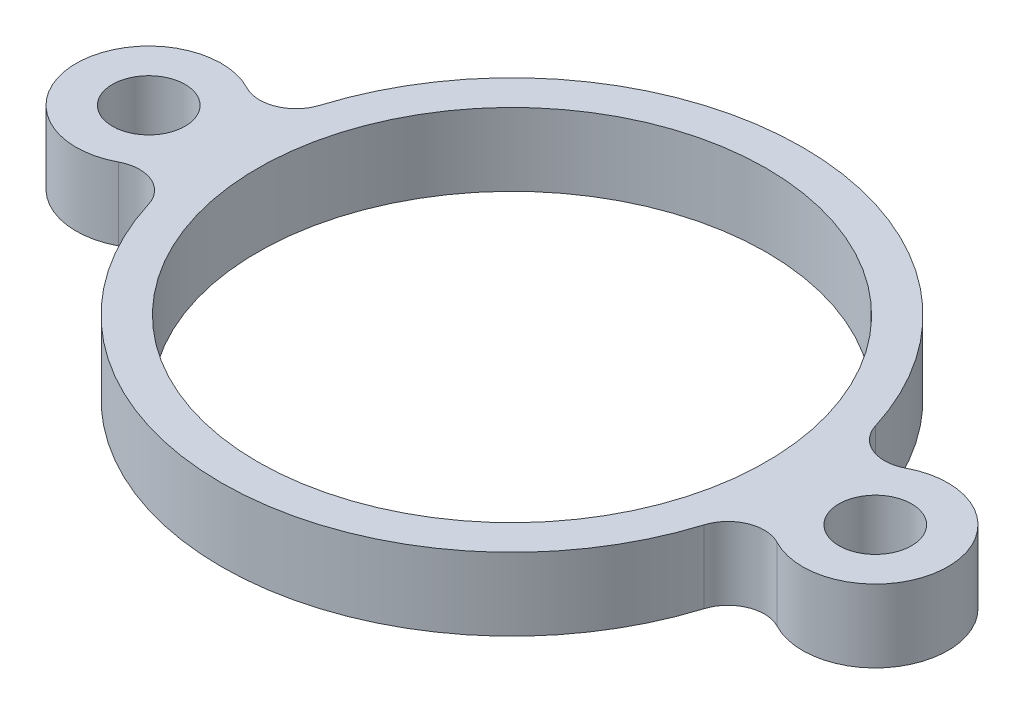
ISO-10303-21;
HEADER;
FILE_DESCRIPTION(('STEP AP214'),'2;1');
FILE_NAME('part.step','',(''),(''),'','','');
FILE_SCHEMA(('AUTOMOTIVE_DESIGN { 1 0 10303 214 1 1 1 1 }'));
ENDSEC;
DATA;
#1=APPLICATION_CONTEXT('core data for automotive mechanical design processes');
#2=APPLICATION_PROTOCOL_DEFINITION('international standard','automotive_design',2000,#1);
#3=PRODUCT_CONTEXT('',#1,'mechanical');
#4=PRODUCT('Part','Part','',(#3));
#5=PRODUCT_RELATED_PRODUCT_CATEGORY('part','',(#4));
#6=PRODUCT_DEFINITION_FORMATION('','',#4);
#7=PRODUCT_DEFINITION_CONTEXT('part definition',#1,'design');
#8=PRODUCT_DEFINITION('design','',#6,#7);
#9=PRODUCT_DEFINITION_SHAPE('','',#8);
#10=(LENGTH_UNIT() NAMED_UNIT(*) SI_UNIT(.MILLI.,.METRE.));
#11=(NAMED_UNIT(*) PLANE_ANGLE_UNIT() SI_UNIT($,.RADIAN.));
#12=(NAMED_UNIT(*) SI_UNIT($,.STERADIAN.) SOLID_ANGLE_UNIT());
#13=UNCERTAINTY_MEASURE_WITH_UNIT(LENGTH_MEASURE(1.E-05),#10,'distance_accuracy_value','');
#14=(GEOMETRIC_REPRESENTATION_CONTEXT(3) GLOBAL_UNCERTAINTY_ASSIGNED_CONTEXT((#13)) GLOBAL_UNIT_ASSIGNED_CONTEXT((#10,
#11,#12)) REPRESENTATION_CONTEXT('',''));
#15=CARTESIAN_POINT('',(0.,0.,0.));
#16=DIRECTION('',(0.,0.,1.));
#17=DIRECTION('',(1.,0.,0.));
#18=AXIS2_PLACEMENT_3D('',#15,#16,#17);
#19=CARTESIAN_POINT('',(21.5,10.,6.6332495807108));
#20=DIRECTION('',(0.,1.,0.));
#21=DIRECTION('',(0.,0.,1.));
#22=AXIS2_PLACEMENT_3D('',#19,#20,#21);
#23=PLANE('',#22);
#24=CARTESIAN_POINT('',(50.,10.,0.));
#25=DIRECTION('',(0.,1.,0.));
#26=DIRECTION('',(0.,0.,1.));
#27=AXIS2_PLACEMENT_3D('',#24,#25,#26);
#28=CIRCLE('',#27,5.);
#29=CARTESIAN_POINT('',(50.,10.,5.));
#30=VERTEX_POINT('',#29);
#31=EDGE_CURVE('E219',#30,#30,#28,.T.);
#32=ORIENTED_EDGE('',*,*,#31,.F.);
#33=EDGE_LOOP('',(#32));
#34=FACE_BOUND('',#33,.T.);
#35=CARTESIAN_POINT('',(43.,10.,13.2664991614216));
#36=DIRECTION('',(0.,-1.,0.));
#37=DIRECTION('',(0.,0.,1.));
#38=AXIS2_PLACEMENT_3D('',#35,#36,#37);
#39=CIRCLE('',#38,5.);
#40=CARTESIAN_POINT('',(38.2222222222222,10.,11.7924436990414));
#41=VERTEX_POINT('',#40);
#42=CARTESIAN_POINT('',(45.3333333333333,10.,8.84433277428107));
#43=VERTEX_POINT('',#42);
#44=EDGE_CURVE('E170',#41,#43,#39,.T.);
#45=ORIENTED_EDGE('',*,*,#44,.T.);
#46=CARTESIAN_POINT('',(50.,10.,0.));
#47=DIRECTION('',(0.,1.,0.));
#48=DIRECTION('',(0.,0.,1.));
#49=AXIS2_PLACEMENT_3D('',#46,#47,#48);
#50=CIRCLE('',#49,10.);
#51=CARTESIAN_POINT('',(45.3333333333333,10.,-8.84433277428107));
#52=VERTEX_POINT('',#51);
#53=EDGE_CURVE('E106',#43,#52,#50,.T.);
#54=ORIENTED_EDGE('',*,*,#53,.T.);
#55=CARTESIAN_POINT('',(43.,10.,-13.2664991614216));
#56=DIRECTION('',(0.,-1.,0.));
#57=DIRECTION('',(0.,0.,-1.));
#58=AXIS2_PLACEMENT_3D('',#55,#56,#57);
#59=CIRCLE('',#58,5.);
#60=CARTESIAN_POINT('',(38.2222222222222,10.,-11.7924436990414));
#61=VERTEX_POINT('',#60);
#62=EDGE_CURVE('E191',#52,#61,#59,.T.);
#63=ORIENTED_EDGE('',*,*,#62,.T.);
#64=CARTESIAN_POINT('',(0.,10.,0.));
#65=DIRECTION('',(0.,1.,0.));
#66=DIRECTION('',(0.,0.,1.));
#67=AXIS2_PLACEMENT_3D('',#64,#65,#66);
#68=CIRCLE('',#67,40.);
#69=CARTESIAN_POINT('',(-38.2222222222222,10.,-11.7924436990414));
#70=VERTEX_POINT('',#69);
#71=EDGE_CURVE('E205',#61,#70,#68,.T.);
#72=ORIENTED_EDGE('',*,*,#71,.T.);
#73=CARTESIAN_POINT('',(-43.,10.,-13.2664991614216));
#74=DIRECTION('',(0.,-1.,0.));
#75=DIRECTION('',(0.,0.,1.));
#76=AXIS2_PLACEMENT_3D('',#73,#74,#75);
#77=CIRCLE('',#76,5.);
#78=CARTESIAN_POINT('',(-45.3333333333333,10.,-8.84433277428106));
#79=VERTEX_POINT('',#78);
#80=EDGE_CURVE('E125',#70,#79,#77,.T.);
#81=ORIENTED_EDGE('',*,*,#80,.T.);
#82=CARTESIAN_POINT('',(-50.,10.,0.));
#83=DIRECTION('',(0.,1.,0.));
#84=DIRECTION('',(0.,0.,1.));
#85=AXIS2_PLACEMENT_3D('',#82,#83,#84);
#86=CIRCLE('',#85,10.);
#87=CARTESIAN_POINT('',(-45.3333333333333,10.,8.84433277428107));
#88=VERTEX_POINT('',#87);
#89=EDGE_CURVE('E119',#79,#88,#86,.T.);
#90=ORIENTED_EDGE('',*,*,#89,.T.);
#91=CARTESIAN_POINT('',(-43.,10.,13.2664991614216));
#92=DIRECTION('',(0.,-1.,0.));
#93=DIRECTION('',(0.,0.,-1.));
#94=AXIS2_PLACEMENT_3D('',#91,#92,#93);
#95=CIRCLE('',#94,5.);
#96=CARTESIAN_POINT('',(-38.2222222222222,10.,11.7924436990414));
#97=VERTEX_POINT('',#96);
#98=EDGE_CURVE('E123',#88,#97,#95,.T.);
#99=ORIENTED_EDGE('',*,*,#98,.T.);
#100=CARTESIAN_POINT('',(0.,10.,0.));
#101=DIRECTION('',(0.,1.,0.));
#102=DIRECTION('',(0.,0.,1.));
#103=AXIS2_PLACEMENT_3D('',#100,#101,#102);
#104=CIRCLE('',#103,40.);
#105=EDGE_CURVE('E63',#97,#41,#104,.T.);
#106=ORIENTED_EDGE('',*,*,#105,.T.);
#107=EDGE_LOOP('',(#45,#54,#63,#72,#81,#90,#99,#106));
#108=FACE_BOUND('',#107,.T.);
#109=CARTESIAN_POINT('',(0.,10.,0.));
#110=DIRECTION('',(0.,1.,0.));
#111=DIRECTION('',(0.,0.,1.));
#112=AXIS2_PLACEMENT_3D('',#109,#110,#111);
#113=CIRCLE('',#112,35.);
#114=CARTESIAN_POINT('',(0.,10.,35.));
#115=VERTEX_POINT('',#114);
#116=EDGE_CURVE('E152',#115,#115,#113,.T.);
#117=ORIENTED_EDGE('',*,*,#116,.F.);
#118=EDGE_LOOP('',(#117));
#119=FACE_BOUND('',#118,.T.);
#120=CARTESIAN_POINT('',(-50.,10.,0.));
#121=DIRECTION('',(0.,1.,0.));
#122=DIRECTION('',(0.,0.,1.));
#123=AXIS2_PLACEMENT_3D('',#120,#121,#122);
#124=CIRCLE('',#123,5.);
#125=CARTESIAN_POINT('',(-50.,10.,5.));
#126=VERTEX_POINT('',#125);
#127=EDGE_CURVE('E227',#126,#126,#124,.T.);
#128=ORIENTED_EDGE('',*,*,#127,.F.);
#129=EDGE_LOOP('',(#128));
#130=FACE_BOUND('',#129,.T.);
#131=ADVANCED_FACE('F45',(#34,#108,#119,#130),#23,.T.);
#132=CARTESIAN_POINT('',(21.5,0.,6.6332495807108));
#133=DIRECTION('',(0.,1.,0.));
#134=DIRECTION('',(0.,0.,1.));
#135=AXIS2_PLACEMENT_3D('',#132,#133,#134);
#136=PLANE('',#135);
#137=CARTESIAN_POINT('',(43.,0.,13.2664991614216));
#138=DIRECTION('',(0.,-1.,0.));
#139=DIRECTION('',(0.,0.,1.));
#140=AXIS2_PLACEMENT_3D('',#137,#138,#139);
#141=CIRCLE('',#140,5.);
#142=CARTESIAN_POINT('',(38.2222222222222,0.,11.7924436990414));
#143=VERTEX_POINT('',#142);
#144=CARTESIAN_POINT('',(45.3333333333333,0.,8.84433277428107));
#145=VERTEX_POINT('',#144);
#146=EDGE_CURVE('E147',#143,#145,#141,.T.);
#147=ORIENTED_EDGE('',*,*,#146,.F.);
#148=CARTESIAN_POINT('',(0.,0.,0.));
#149=DIRECTION('',(0.,1.,0.));
#150=DIRECTION('',(0.,0.,1.));
#151=AXIS2_PLACEMENT_3D('',#148,#149,#150);
#152=CIRCLE('',#151,40.);
#153=CARTESIAN_POINT('',(-38.2222222222222,0.,11.7924436990414));
#154=VERTEX_POINT('',#153);
#155=EDGE_CURVE('E98',#154,#143,#152,.T.);
#156=ORIENTED_EDGE('',*,*,#155,.F.);
#157=CARTESIAN_POINT('',(-43.,0.,13.2664991614216));
#158=DIRECTION('',(0.,-1.,0.));
#159=DIRECTION('',(0.,0.,-1.));
#160=AXIS2_PLACEMENT_3D('',#157,#158,#159);
#161=CIRCLE('',#160,5.);
#162=CARTESIAN_POINT('',(-45.3333333333333,0.,8.84433277428107));
#163=VERTEX_POINT('',#162);
#164=EDGE_CURVE('E92',#163,#154,#161,.T.);
#165=ORIENTED_EDGE('',*,*,#164,.F.);
#166=CARTESIAN_POINT('',(-50.,0.,0.));
#167=DIRECTION('',(0.,1.,0.));
#168=DIRECTION('',(0.,0.,1.));
#169=AXIS2_PLACEMENT_3D('',#166,#167,#168);
#170=CIRCLE('',#169,10.);
#171=CARTESIAN_POINT('',(-45.3333333333333,0.,-8.84433277428106));
#172=VERTEX_POINT('',#171);
#173=EDGE_CURVE('E134',#172,#163,#170,.T.);
#174=ORIENTED_EDGE('',*,*,#173,.F.);
#175=CARTESIAN_POINT('',(-43.,0.,-13.2664991614216));
#176=DIRECTION('',(0.,-1.,0.));
#177=DIRECTION('',(0.,0.,1.));
#178=AXIS2_PLACEMENT_3D('',#175,#176,#177);
#179=CIRCLE('',#178,5.);
#180=CARTESIAN_POINT('',(-38.2222222222222,0.,-11.7924436990414));
#181=VERTEX_POINT('',#180);
#182=EDGE_CURVE('E161',#181,#172,#179,.T.);
#183=ORIENTED_EDGE('',*,*,#182,.F.);
#184=CARTESIAN_POINT('',(0.,0.,0.));
#185=DIRECTION('',(0.,1.,0.));
#186=DIRECTION('',(0.,0.,1.));
#187=AXIS2_PLACEMENT_3D('',#184,#185,#186);
#188=CIRCLE('',#187,40.);
#189=CARTESIAN_POINT('',(38.2222222222222,0.,-11.7924436990414));
#190=VERTEX_POINT('',#189);
#191=EDGE_CURVE('E158',#190,#181,#188,.T.);
#192=ORIENTED_EDGE('',*,*,#191,.F.);
#193=CARTESIAN_POINT('',(43.,0.,-13.2664991614216));
#194=DIRECTION('',(0.,-1.,0.));
#195=DIRECTION('',(0.,0.,-1.));
#196=AXIS2_PLACEMENT_3D('',#193,#194,#195);
#197=CIRCLE('',#196,5.);
#198=CARTESIAN_POINT('',(45.3333333333333,0.,-8.84433277428107));
#199=VERTEX_POINT('',#198);
#200=EDGE_CURVE('E155',#199,#190,#197,.T.);
#201=ORIENTED_EDGE('',*,*,#200,.F.);
#202=CARTESIAN_POINT('',(50.,0.,0.));
#203=DIRECTION('',(0.,1.,0.));
#204=DIRECTION('',(0.,0.,1.));
#205=AXIS2_PLACEMENT_3D('',#202,#203,#204);
#206=CIRCLE('',#205,10.);
#207=EDGE_CURVE('E151',#145,#199,#206,.T.);
#208=ORIENTED_EDGE('',*,*,#207,.F.);
#209=EDGE_LOOP('',(#147,#156,#165,#174,#183,#192,#201,#208));
#210=FACE_BOUND('',#209,.T.);
#211=CARTESIAN_POINT('',(0.,0.,0.));
#212=DIRECTION('',(0.,1.,0.));
#213=DIRECTION('',(0.,0.,1.));
#214=AXIS2_PLACEMENT_3D('',#211,#212,#213);
#215=CIRCLE('',#214,35.);
#216=CARTESIAN_POINT('',(0.,0.,35.));
#217=VERTEX_POINT('',#216);
#218=EDGE_CURVE('E215',#217,#217,#215,.T.);
#219=ORIENTED_EDGE('',*,*,#218,.T.);
#220=EDGE_LOOP('',(#219));
#221=FACE_BOUND('',#220,.T.);
#222=CARTESIAN_POINT('',(50.,0.,0.));
#223=DIRECTION('',(0.,1.,0.));
#224=DIRECTION('',(0.,0.,1.));
#225=AXIS2_PLACEMENT_3D('',#222,#223,#224);
#226=CIRCLE('',#225,5.);
#227=CARTESIAN_POINT('',(50.,0.,5.));
#228=VERTEX_POINT('',#227);
#229=EDGE_CURVE('E223',#228,#228,#226,.T.);
#230=ORIENTED_EDGE('',*,*,#229,.T.);
#231=EDGE_LOOP('',(#230));
#232=FACE_BOUND('',#231,.T.);
#233=CARTESIAN_POINT('',(-50.,0.,0.));
#234=DIRECTION('',(0.,1.,0.));
#235=DIRECTION('',(0.,0.,1.));
#236=AXIS2_PLACEMENT_3D('',#233,#234,#235);
#237=CIRCLE('',#236,5.);
#238=CARTESIAN_POINT('',(-50.,0.,5.));
#239=VERTEX_POINT('',#238);
#240=EDGE_CURVE('E231',#239,#239,#237,.T.);
#241=ORIENTED_EDGE('',*,*,#240,.T.);
#242=EDGE_LOOP('',(#241));
#243=FACE_BOUND('',#242,.T.);
#244=ADVANCED_FACE('F195',(#210,#221,#232,#243),#136,.F.);
#245=CARTESIAN_POINT('',(43.,10.,13.2664991614216));
#246=DIRECTION('',(0.,-1.,0.));
#247=DIRECTION('',(0.,0.,-1.));
#248=AXIS2_PLACEMENT_3D('',#245,#246,#247);
#249=CYLINDRICAL_SURFACE('',#248,5.);
#250=ORIENTED_EDGE('',*,*,#146,.T.);
#251=DIRECTION('',(0.,-1.,0.));
#252=VECTOR('',#251,1.);
#253=CARTESIAN_POINT('',(45.3333333333333,10.,8.84433277428107));
#254=LINE('',#253,#252);
#255=EDGE_CURVE('E11',#43,#145,#254,.T.);
#256=ORIENTED_EDGE('',*,*,#255,.F.);
#257=ORIENTED_EDGE('',*,*,#44,.F.);
#258=DIRECTION('',(0.,-1.,0.));
#259=VECTOR('',#258,1.);
#260=CARTESIAN_POINT('',(38.2222222222222,10.,11.7924436990414));
#261=LINE('',#260,#259);
#262=EDGE_CURVE('E143',#41,#143,#261,.T.);
#263=ORIENTED_EDGE('',*,*,#262,.T.);
#264=EDGE_LOOP('',(#250,#256,#257,#263));
#265=FACE_BOUND('',#264,.T.);
#266=ADVANCED_FACE('F47',(#265),#249,.F.);
#267=CARTESIAN_POINT('',(50.,10.,0.));
#268=DIRECTION('',(0.,-1.,0.));
#269=DIRECTION('',(0.,0.,-1.));
#270=AXIS2_PLACEMENT_3D('',#267,#268,#269);
#271=CYLINDRICAL_SURFACE('',#270,10.);
#272=ORIENTED_EDGE('',*,*,#207,.T.);
#273=DIRECTION('',(0.,-1.,0.));
#274=VECTOR('',#273,1.);
#275=CARTESIAN_POINT('',(45.3333333333333,10.,-8.84433277428107));
#276=LINE('',#275,#274);
#277=EDGE_CURVE('E55',#52,#199,#276,.T.);
#278=ORIENTED_EDGE('',*,*,#277,.F.);
#279=ORIENTED_EDGE('',*,*,#53,.F.);
#280=ORIENTED_EDGE('',*,*,#255,.T.);
#281=EDGE_LOOP('',(#272,#278,#279,#280));
#282=FACE_BOUND('',#281,.T.);
#283=ADVANCED_FACE('F266',(#282),#271,.T.);
#284=CARTESIAN_POINT('',(43.,10.,-13.2664991614216));
#285=DIRECTION('',(0.,-1.,0.));
#286=DIRECTION('',(0.,0.,-1.));
#287=AXIS2_PLACEMENT_3D('',#284,#285,#286);
#288=CYLINDRICAL_SURFACE('',#287,5.);
#289=ORIENTED_EDGE('',*,*,#200,.T.);
#290=DIRECTION('',(0.,-1.,0.));
#291=VECTOR('',#290,1.);
#292=CARTESIAN_POINT('',(38.2222222222222,10.,-11.7924436990414));
#293=LINE('',#292,#291);
#294=EDGE_CURVE('E181',#61,#190,#293,.T.);
#295=ORIENTED_EDGE('',*,*,#294,.F.);
#296=ORIENTED_EDGE('',*,*,#62,.F.);
#297=ORIENTED_EDGE('',*,*,#277,.T.);
#298=EDGE_LOOP('',(#289,#295,#296,#297));
#299=FACE_BOUND('',#298,.T.);
#300=ADVANCED_FACE('F189',(#299),#288,.F.);
#301=CARTESIAN_POINT('',(0.,10.,0.));
#302=DIRECTION('',(0.,-1.,0.));
#303=DIRECTION('',(0.,0.,-1.));
#304=AXIS2_PLACEMENT_3D('',#301,#302,#303);
#305=CYLINDRICAL_SURFACE('',#304,40.);
#306=ORIENTED_EDGE('',*,*,#191,.T.);
#307=DIRECTION('',(0.,-1.,0.));
#308=VECTOR('',#307,1.);
#309=CARTESIAN_POINT('',(-38.2222222222222,10.,-11.7924436990414));
#310=LINE('',#309,#308);
#311=EDGE_CURVE('E177',#70,#181,#310,.T.);
#312=ORIENTED_EDGE('',*,*,#311,.F.);
#313=ORIENTED_EDGE('',*,*,#71,.F.);
#314=ORIENTED_EDGE('',*,*,#294,.T.);
#315=EDGE_LOOP('',(#306,#312,#313,#314));
#316=FACE_BOUND('',#315,.T.);
#317=ADVANCED_FACE('F200',(#316),#305,.T.);
#318=CARTESIAN_POINT('',(-43.,10.,-13.2664991614216));
#319=DIRECTION('',(0.,-1.,0.));
#320=DIRECTION('',(0.,0.,-1.));
#321=AXIS2_PLACEMENT_3D('',#318,#319,#320);
#322=CYLINDRICAL_SURFACE('',#321,5.);
#323=ORIENTED_EDGE('',*,*,#182,.T.);
#324=DIRECTION('',(0.,-1.,0.));
#325=VECTOR('',#324,1.);
#326=CARTESIAN_POINT('',(-45.3333333333333,10.,-8.84433277428106));
#327=LINE('',#326,#325);
#328=EDGE_CURVE('E136',#79,#172,#327,.T.);
#329=ORIENTED_EDGE('',*,*,#328,.F.);
#330=ORIENTED_EDGE('',*,*,#80,.F.);
#331=ORIENTED_EDGE('',*,*,#311,.T.);
#332=EDGE_LOOP('',(#323,#329,#330,#331));
#333=FACE_BOUND('',#332,.T.);
#334=ADVANCED_FACE('F203',(#333),#322,.F.);
#335=CARTESIAN_POINT('',(-50.,10.,0.));
#336=DIRECTION('',(0.,-1.,0.));
#337=DIRECTION('',(0.,0.,-1.));
#338=AXIS2_PLACEMENT_3D('',#335,#336,#337);
#339=CYLINDRICAL_SURFACE('',#338,10.);
#340=ORIENTED_EDGE('',*,*,#173,.T.);
#341=DIRECTION('',(0.,-1.,0.));
#342=VECTOR('',#341,1.);
#343=CARTESIAN_POINT('',(-45.3333333333333,10.,8.84433277428107));
#344=LINE('',#343,#342);
#345=EDGE_CURVE('E131',#88,#163,#344,.T.);
#346=ORIENTED_EDGE('',*,*,#345,.F.);
#347=ORIENTED_EDGE('',*,*,#89,.F.);
#348=ORIENTED_EDGE('',*,*,#328,.T.);
#349=EDGE_LOOP('',(#340,#346,#347,#348));
#350=FACE_BOUND('',#349,.T.);
#351=ADVANCED_FACE('F132',(#350),#339,.T.);
#352=CARTESIAN_POINT('',(-43.,10.,13.2664991614216));
#353=DIRECTION('',(0.,-1.,0.));
#354=DIRECTION('',(0.,0.,-1.));
#355=AXIS2_PLACEMENT_3D('',#352,#353,#354);
#356=CYLINDRICAL_SURFACE('',#355,5.);
#357=ORIENTED_EDGE('',*,*,#164,.T.);
#358=DIRECTION('',(0.,-1.,0.));
#359=VECTOR('',#358,1.);
#360=CARTESIAN_POINT('',(-38.2222222222222,10.,11.7924436990414));
#361=LINE('',#360,#359);
#362=EDGE_CURVE('E137',#97,#154,#361,.T.);
#363=ORIENTED_EDGE('',*,*,#362,.F.);
#364=ORIENTED_EDGE('',*,*,#98,.F.);
#365=ORIENTED_EDGE('',*,*,#345,.T.);
#366=EDGE_LOOP('',(#357,#363,#364,#365));
#367=FACE_BOUND('',#366,.T.);
#368=ADVANCED_FACE('F139',(#367),#356,.F.);
#369=CARTESIAN_POINT('',(0.,10.,0.));
#370=DIRECTION('',(0.,-1.,0.));
#371=DIRECTION('',(0.,0.,-1.));
#372=AXIS2_PLACEMENT_3D('',#369,#370,#371);
#373=CYLINDRICAL_SURFACE('',#372,40.);
#374=ORIENTED_EDGE('',*,*,#155,.T.);
#375=ORIENTED_EDGE('',*,*,#262,.F.);
#376=ORIENTED_EDGE('',*,*,#105,.F.);
#377=ORIENTED_EDGE('',*,*,#362,.T.);
#378=EDGE_LOOP('',(#374,#375,#376,#377));
#379=FACE_BOUND('',#378,.T.);
#380=ADVANCED_FACE('F254',(#379),#373,.T.);
#381=CARTESIAN_POINT('',(0.,10.,0.));
#382=DIRECTION('',(0.,-1.,0.));
#383=DIRECTION('',(0.,0.,-1.));
#384=AXIS2_PLACEMENT_3D('',#381,#382,#383);
#385=CYLINDRICAL_SURFACE('',#384,35.);
#386=ORIENTED_EDGE('',*,*,#116,.T.);
#387=EDGE_LOOP('',(#386));
#388=FACE_BOUND('',#387,.T.);
#389=ORIENTED_EDGE('',*,*,#218,.F.);
#390=EDGE_LOOP('',(#389));
#391=FACE_BOUND('',#390,.T.);
#392=ADVANCED_FACE('F251',(#388,#391),#385,.F.);
#393=CARTESIAN_POINT('',(50.,10.,0.));
#394=DIRECTION('',(0.,-1.,0.));
#395=DIRECTION('',(0.,0.,-1.));
#396=AXIS2_PLACEMENT_3D('',#393,#394,#395);
#397=CYLINDRICAL_SURFACE('',#396,5.);
#398=ORIENTED_EDGE('',*,*,#31,.T.);
#399=EDGE_LOOP('',(#398));
#400=FACE_BOUND('',#399,.T.);
#401=ORIENTED_EDGE('',*,*,#229,.F.);
#402=EDGE_LOOP('',(#401));
#403=FACE_BOUND('',#402,.T.);
#404=ADVANCED_FACE('F329',(#400,#403),#397,.F.);
#405=CARTESIAN_POINT('',(-50.,10.,0.));
#406=DIRECTION('',(0.,-1.,0.));
#407=DIRECTION('',(0.,0.,-1.));
#408=AXIS2_PLACEMENT_3D('',#405,#406,#407);
#409=CYLINDRICAL_SURFACE('',#408,5.);
#410=ORIENTED_EDGE('',*,*,#127,.T.);
#411=EDGE_LOOP('',(#410));
#412=FACE_BOUND('',#411,.T.);
#413=ORIENTED_EDGE('',*,*,#240,.F.);
#414=EDGE_LOOP('',(#413));
#415=FACE_BOUND('',#414,.T.);
#416=ADVANCED_FACE('F239',(#412,#415),#409,.F.);
#417=CLOSED_SHELL('',(#131,#244,#266,#283,#300,#317,#334,#351,#368,#380,#392,#404,#416));
#418=MANIFOLD_SOLID_BREP('B2',#417);
#419=ADVANCED_BREP_SHAPE_REPRESENTATION('',(#18,#418),#14);
#420=SHAPE_DEFINITION_REPRESENTATION(#9,#419);
ENDSEC;
END-ISO-10303-21;
